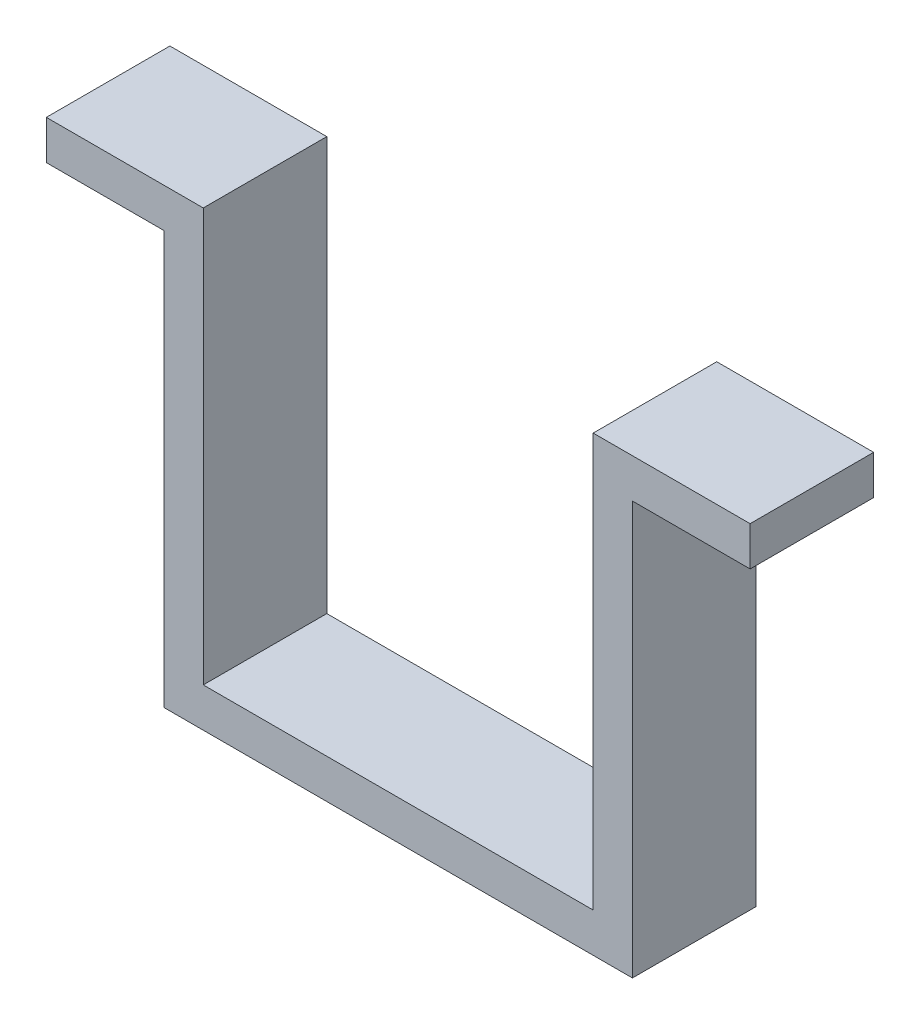
ISO-10303-21;
HEADER;
FILE_DESCRIPTION(('STEP AP214'),'2;1');
FILE_NAME('part.step','',(''),(''),'','','');
FILE_SCHEMA(('AUTOMOTIVE_DESIGN { 1 0 10303 214 1 1 1 1 }'));
ENDSEC;
DATA;
#1=APPLICATION_CONTEXT('core data for automotive mechanical design processes');
#2=APPLICATION_PROTOCOL_DEFINITION('international standard','automotive_design',2000,#1);
#3=PRODUCT_CONTEXT('',#1,'mechanical');
#4=PRODUCT('Part','Part','',(#3));
#5=PRODUCT_RELATED_PRODUCT_CATEGORY('part','',(#4));
#6=PRODUCT_DEFINITION_FORMATION('','',#4);
#7=PRODUCT_DEFINITION_CONTEXT('part definition',#1,'design');
#8=PRODUCT_DEFINITION('design','',#6,#7);
#9=PRODUCT_DEFINITION_SHAPE('','',#8);
#10=(LENGTH_UNIT() NAMED_UNIT(*) SI_UNIT(.MILLI.,.METRE.));
#11=(NAMED_UNIT(*) PLANE_ANGLE_UNIT() SI_UNIT($,.RADIAN.));
#12=(NAMED_UNIT(*) SI_UNIT($,.STERADIAN.) SOLID_ANGLE_UNIT());
#13=UNCERTAINTY_MEASURE_WITH_UNIT(LENGTH_MEASURE(1.E-05),#10,'distance_accuracy_value','');
#14=(GEOMETRIC_REPRESENTATION_CONTEXT(3) GLOBAL_UNCERTAINTY_ASSIGNED_CONTEXT((#13)) GLOBAL_UNIT_ASSIGNED_CONTEXT((#10,
#11,#12)) REPRESENTATION_CONTEXT('',''));
#15=CARTESIAN_POINT('',(0.,0.,0.));
#16=DIRECTION('',(0.,0.,1.));
#17=DIRECTION('',(1.,0.,0.));
#18=AXIS2_PLACEMENT_3D('',#15,#16,#17);
#19=CARTESIAN_POINT('',(-15.78,16.7165,10.));
#20=DIRECTION('',(0.,-1.,0.));
#21=DIRECTION('',(1.,0.,0.));
#22=AXIS2_PLACEMENT_3D('',#19,#20,#21);
#23=PLANE('',#22);
#24=DIRECTION('',(-1.,0.,0.));
#25=VECTOR('',#24,1.);
#26=CARTESIAN_POINT('',(-15.78,16.7165,0.));
#27=LINE('',#26,#25);
#28=CARTESIAN_POINT('',(-15.78,16.7165,0.));
#29=VERTEX_POINT('',#28);
#30=CARTESIAN_POINT('',(-28.48,16.7165,0.));
#31=VERTEX_POINT('',#30);
#32=EDGE_CURVE('E165',#29,#31,#27,.T.);
#33=ORIENTED_EDGE('',*,*,#32,.T.);
#34=DIRECTION('',(0.,0.,-1.));
#35=VECTOR('',#34,1.);
#36=CARTESIAN_POINT('',(-28.48,16.7165,10.));
#37=LINE('',#36,#35);
#38=CARTESIAN_POINT('',(-28.48,16.7165,10.));
#39=VERTEX_POINT('',#38);
#40=EDGE_CURVE('E11',#39,#31,#37,.T.);
#41=ORIENTED_EDGE('',*,*,#40,.F.);
#42=DIRECTION('',(-1.,0.,0.));
#43=VECTOR('',#42,1.);
#44=CARTESIAN_POINT('',(-15.78,16.7165,10.));
#45=LINE('',#44,#43);
#46=CARTESIAN_POINT('',(-15.78,16.7165,10.));
#47=VERTEX_POINT('',#46);
#48=EDGE_CURVE('E208',#47,#39,#45,.T.);
#49=ORIENTED_EDGE('',*,*,#48,.F.);
#50=DIRECTION('',(0.,0.,-1.));
#51=VECTOR('',#50,1.);
#52=CARTESIAN_POINT('',(-15.78,16.7165,10.));
#53=LINE('',#52,#51);
#54=EDGE_CURVE('E56',#47,#29,#53,.T.);
#55=ORIENTED_EDGE('',*,*,#54,.T.);
#56=EDGE_LOOP('',(#33,#41,#49,#55));
#57=FACE_BOUND('',#56,.T.);
#58=ADVANCED_FACE('F39',(#57),#23,.F.);
#59=CARTESIAN_POINT('',(-28.48,16.7165,10.));
#60=DIRECTION('',(1.,0.,0.));
#61=DIRECTION('',(0.,0.,-1.));
#62=AXIS2_PLACEMENT_3D('',#59,#60,#61);
#63=PLANE('',#62);
#64=DIRECTION('',(0.,-1.,0.));
#65=VECTOR('',#64,1.);
#66=CARTESIAN_POINT('',(-28.48,16.7165,0.));
#67=LINE('',#66,#65);
#68=CARTESIAN_POINT('',(-28.48,13.5415,0.));
#69=VERTEX_POINT('',#68);
#70=EDGE_CURVE('E168',#31,#69,#67,.T.);
#71=ORIENTED_EDGE('',*,*,#70,.T.);
#72=DIRECTION('',(0.,0.,-1.));
#73=VECTOR('',#72,1.);
#74=CARTESIAN_POINT('',(-28.48,13.5415,10.));
#75=LINE('',#74,#73);
#76=CARTESIAN_POINT('',(-28.48,13.5415,10.));
#77=VERTEX_POINT('',#76);
#78=EDGE_CURVE('E48',#77,#69,#75,.T.);
#79=ORIENTED_EDGE('',*,*,#78,.F.);
#80=DIRECTION('',(0.,-1.,0.));
#81=VECTOR('',#80,1.);
#82=CARTESIAN_POINT('',(-28.48,16.7165,10.));
#83=LINE('',#82,#81);
#84=EDGE_CURVE('E107',#39,#77,#83,.T.);
#85=ORIENTED_EDGE('',*,*,#84,.F.);
#86=ORIENTED_EDGE('',*,*,#40,.T.);
#87=EDGE_LOOP('',(#71,#79,#85,#86));
#88=FACE_BOUND('',#87,.T.);
#89=ADVANCED_FACE('F240',(#88),#63,.F.);
#90=CARTESIAN_POINT('',(-18.955,13.5415,10.));
#91=DIRECTION('',(0.,-1.,0.));
#92=DIRECTION('',(1.,0.,0.));
#93=AXIS2_PLACEMENT_3D('',#90,#91,#92);
#94=PLANE('',#93);
#95=DIRECTION('',(-1.,0.,0.));
#96=VECTOR('',#95,1.);
#97=CARTESIAN_POINT('',(-18.955,13.5415,0.));
#98=LINE('',#97,#96);
#99=CARTESIAN_POINT('',(-18.955,13.5415,0.));
#100=VERTEX_POINT('',#99);
#101=EDGE_CURVE('E172',#100,#69,#98,.T.);
#102=ORIENTED_EDGE('',*,*,#101,.F.);
#103=DIRECTION('',(0.,0.,-1.));
#104=VECTOR('',#103,1.);
#105=CARTESIAN_POINT('',(-18.955,13.5415,10.));
#106=LINE('',#105,#104);
#107=CARTESIAN_POINT('',(-18.955,13.5415,10.));
#108=VERTEX_POINT('',#107);
#109=EDGE_CURVE('E231',#108,#100,#106,.T.);
#110=ORIENTED_EDGE('',*,*,#109,.F.);
#111=DIRECTION('',(-1.,0.,0.));
#112=VECTOR('',#111,1.);
#113=CARTESIAN_POINT('',(-18.955,13.5415,10.));
#114=LINE('',#113,#112);
#115=EDGE_CURVE('E239',#108,#77,#114,.T.);
#116=ORIENTED_EDGE('',*,*,#115,.T.);
#117=ORIENTED_EDGE('',*,*,#78,.T.);
#118=EDGE_LOOP('',(#102,#110,#116,#117));
#119=FACE_BOUND('',#118,.T.);
#120=ADVANCED_FACE('F237',(#119),#94,.T.);
#121=CARTESIAN_POINT('',(-18.955,13.5415,10.));
#122=DIRECTION('',(1.,0.,0.));
#123=DIRECTION('',(0.,1.,0.));
#124=AXIS2_PLACEMENT_3D('',#121,#122,#123);
#125=PLANE('',#124);
#126=DIRECTION('',(0.,-1.,0.));
#127=VECTOR('',#126,1.);
#128=CARTESIAN_POINT('',(-18.955,13.5415,0.));
#129=LINE('',#128,#127);
#130=CARTESIAN_POINT('',(-18.955,-19.8915,0.));
#131=VERTEX_POINT('',#130);
#132=EDGE_CURVE('E176',#100,#131,#129,.T.);
#133=ORIENTED_EDGE('',*,*,#132,.T.);
#134=DIRECTION('',(0.,0.,-1.));
#135=VECTOR('',#134,1.);
#136=CARTESIAN_POINT('',(-18.955,-19.8915,10.));
#137=LINE('',#136,#135);
#138=CARTESIAN_POINT('',(-18.955,-19.8915,10.));
#139=VERTEX_POINT('',#138);
#140=EDGE_CURVE('E227',#139,#131,#137,.T.);
#141=ORIENTED_EDGE('',*,*,#140,.F.);
#142=DIRECTION('',(0.,-1.,0.));
#143=VECTOR('',#142,1.);
#144=CARTESIAN_POINT('',(-18.955,13.5415,10.));
#145=LINE('',#144,#143);
#146=EDGE_CURVE('E259',#108,#139,#145,.T.);
#147=ORIENTED_EDGE('',*,*,#146,.F.);
#148=ORIENTED_EDGE('',*,*,#109,.T.);
#149=EDGE_LOOP('',(#133,#141,#147,#148));
#150=FACE_BOUND('',#149,.T.);
#151=ADVANCED_FACE('F248',(#150),#125,.F.);
#152=CARTESIAN_POINT('',(18.955,-19.8915,10.));
#153=DIRECTION('',(0.,-1.,0.));
#154=DIRECTION('',(0.,0.,-1.));
#155=AXIS2_PLACEMENT_3D('',#152,#153,#154);
#156=PLANE('',#155);
#157=DIRECTION('',(-1.,0.,0.));
#158=VECTOR('',#157,1.);
#159=CARTESIAN_POINT('',(18.955,-19.8915,0.));
#160=LINE('',#159,#158);
#161=CARTESIAN_POINT('',(18.955,-19.8915,0.));
#162=VERTEX_POINT('',#161);
#163=EDGE_CURVE('E180',#162,#131,#160,.T.);
#164=ORIENTED_EDGE('',*,*,#163,.F.);
#165=DIRECTION('',(0.,0.,-1.));
#166=VECTOR('',#165,1.);
#167=CARTESIAN_POINT('',(18.955,-19.8915,10.));
#168=LINE('',#167,#166);
#169=CARTESIAN_POINT('',(18.955,-19.8915,10.));
#170=VERTEX_POINT('',#169);
#171=EDGE_CURVE('E224',#170,#162,#168,.T.);
#172=ORIENTED_EDGE('',*,*,#171,.F.);
#173=DIRECTION('',(1.,0.,0.));
#174=VECTOR('',#173,1.);
#175=CARTESIAN_POINT('',(-18.955,-19.8915,10.));
#176=LINE('',#175,#174);
#177=EDGE_CURVE('E254',#139,#170,#176,.T.);
#178=ORIENTED_EDGE('',*,*,#177,.F.);
#179=ORIENTED_EDGE('',*,*,#140,.T.);
#180=EDGE_LOOP('',(#164,#172,#178,#179));
#181=FACE_BOUND('',#180,.T.);
#182=ADVANCED_FACE('F252',(#181),#156,.T.);
#183=CARTESIAN_POINT('',(18.955,13.5415,10.));
#184=DIRECTION('',(1.,0.,0.));
#185=DIRECTION('',(0.,1.,0.));
#186=AXIS2_PLACEMENT_3D('',#183,#184,#185);
#187=PLANE('',#186);
#188=DIRECTION('',(0.,-1.,0.));
#189=VECTOR('',#188,1.);
#190=CARTESIAN_POINT('',(18.955,13.5415,0.));
#191=LINE('',#190,#189);
#192=CARTESIAN_POINT('',(18.955,13.5415,0.));
#193=VERTEX_POINT('',#192);
#194=EDGE_CURVE('E183',#193,#162,#191,.T.);
#195=ORIENTED_EDGE('',*,*,#194,.F.);
#196=DIRECTION('',(0.,0.,-1.));
#197=VECTOR('',#196,1.);
#198=CARTESIAN_POINT('',(18.955,13.5415,10.));
#199=LINE('',#198,#197);
#200=CARTESIAN_POINT('',(18.955,13.5415,10.));
#201=VERTEX_POINT('',#200);
#202=EDGE_CURVE('E221',#201,#193,#199,.T.);
#203=ORIENTED_EDGE('',*,*,#202,.F.);
#204=DIRECTION('',(0.,-1.,0.));
#205=VECTOR('',#204,1.);
#206=CARTESIAN_POINT('',(18.955,13.5415,10.));
#207=LINE('',#206,#205);
#208=EDGE_CURVE('E258',#201,#170,#207,.T.);
#209=ORIENTED_EDGE('',*,*,#208,.T.);
#210=ORIENTED_EDGE('',*,*,#171,.T.);
#211=EDGE_LOOP('',(#195,#203,#209,#210));
#212=FACE_BOUND('',#211,.T.);
#213=ADVANCED_FACE('F306',(#212),#187,.T.);
#214=CARTESIAN_POINT('',(18.955,13.5415,10.));
#215=DIRECTION('',(0.,1.,0.));
#216=DIRECTION('',(0.,0.,1.));
#217=AXIS2_PLACEMENT_3D('',#214,#215,#216);
#218=PLANE('',#217);
#219=DIRECTION('',(1.,0.,0.));
#220=VECTOR('',#219,1.);
#221=CARTESIAN_POINT('',(18.955,13.5415,0.));
#222=LINE('',#221,#220);
#223=CARTESIAN_POINT('',(28.48,13.5415,0.));
#224=VERTEX_POINT('',#223);
#225=EDGE_CURVE('E187',#193,#224,#222,.T.);
#226=ORIENTED_EDGE('',*,*,#225,.T.);
#227=DIRECTION('',(0.,0.,-1.));
#228=VECTOR('',#227,1.);
#229=CARTESIAN_POINT('',(28.48,13.5415,10.));
#230=LINE('',#229,#228);
#231=CARTESIAN_POINT('',(28.48,13.5415,10.));
#232=VERTEX_POINT('',#231);
#233=EDGE_CURVE('E218',#232,#224,#230,.T.);
#234=ORIENTED_EDGE('',*,*,#233,.F.);
#235=DIRECTION('',(1.,0.,0.));
#236=VECTOR('',#235,1.);
#237=CARTESIAN_POINT('',(18.955,13.5415,10.));
#238=LINE('',#237,#236);
#239=EDGE_CURVE('E263',#201,#232,#238,.T.);
#240=ORIENTED_EDGE('',*,*,#239,.F.);
#241=ORIENTED_EDGE('',*,*,#202,.T.);
#242=EDGE_LOOP('',(#226,#234,#240,#241));
#243=FACE_BOUND('',#242,.T.);
#244=ADVANCED_FACE('F309',(#243),#218,.F.);
#245=CARTESIAN_POINT('',(28.48,16.7165,10.));
#246=DIRECTION('',(1.,0.,0.));
#247=DIRECTION('',(0.,0.,-1.));
#248=AXIS2_PLACEMENT_3D('',#245,#246,#247);
#249=PLANE('',#248);
#250=DIRECTION('',(0.,-1.,0.));
#251=VECTOR('',#250,1.);
#252=CARTESIAN_POINT('',(28.48,16.7165,0.));
#253=LINE('',#252,#251);
#254=CARTESIAN_POINT('',(28.48,16.7165,0.));
#255=VERTEX_POINT('',#254);
#256=EDGE_CURVE('E191',#255,#224,#253,.T.);
#257=ORIENTED_EDGE('',*,*,#256,.F.);
#258=DIRECTION('',(0.,0.,-1.));
#259=VECTOR('',#258,1.);
#260=CARTESIAN_POINT('',(28.48,16.7165,10.));
#261=LINE('',#260,#259);
#262=CARTESIAN_POINT('',(28.48,16.7165,10.));
#263=VERTEX_POINT('',#262);
#264=EDGE_CURVE('E215',#263,#255,#261,.T.);
#265=ORIENTED_EDGE('',*,*,#264,.F.);
#266=DIRECTION('',(0.,-1.,0.));
#267=VECTOR('',#266,1.);
#268=CARTESIAN_POINT('',(28.48,16.7165,10.));
#269=LINE('',#268,#267);
#270=EDGE_CURVE('E270',#263,#232,#269,.T.);
#271=ORIENTED_EDGE('',*,*,#270,.T.);
#272=ORIENTED_EDGE('',*,*,#233,.T.);
#273=EDGE_LOOP('',(#257,#265,#271,#272));
#274=FACE_BOUND('',#273,.T.);
#275=ADVANCED_FACE('F313',(#274),#249,.T.);
#276=CARTESIAN_POINT('',(15.78,16.7165,10.));
#277=DIRECTION('',(0.,1.,0.));
#278=DIRECTION('',(-1.,0.,0.));
#279=AXIS2_PLACEMENT_3D('',#276,#277,#278);
#280=PLANE('',#279);
#281=DIRECTION('',(1.,0.,0.));
#282=VECTOR('',#281,1.);
#283=CARTESIAN_POINT('',(15.78,16.7165,0.));
#284=LINE('',#283,#282);
#285=CARTESIAN_POINT('',(15.78,16.7165,0.));
#286=VERTEX_POINT('',#285);
#287=EDGE_CURVE('E195',#286,#255,#284,.T.);
#288=ORIENTED_EDGE('',*,*,#287,.F.);
#289=DIRECTION('',(0.,0.,-1.));
#290=VECTOR('',#289,1.);
#291=CARTESIAN_POINT('',(15.78,16.7165,10.));
#292=LINE('',#291,#290);
#293=CARTESIAN_POINT('',(15.78,16.7165,10.));
#294=VERTEX_POINT('',#293);
#295=EDGE_CURVE('E155',#294,#286,#292,.T.);
#296=ORIENTED_EDGE('',*,*,#295,.F.);
#297=DIRECTION('',(1.,0.,0.));
#298=VECTOR('',#297,1.);
#299=CARTESIAN_POINT('',(15.78,16.7165,10.));
#300=LINE('',#299,#298);
#301=EDGE_CURVE('E143',#294,#263,#300,.T.);
#302=ORIENTED_EDGE('',*,*,#301,.T.);
#303=ORIENTED_EDGE('',*,*,#264,.T.);
#304=EDGE_LOOP('',(#288,#296,#302,#303));
#305=FACE_BOUND('',#304,.T.);
#306=ADVANCED_FACE('F276',(#305),#280,.T.);
#307=CARTESIAN_POINT('',(15.78,16.7165,10.));
#308=DIRECTION('',(1.,0.,0.));
#309=DIRECTION('',(0.,0.,-1.));
#310=AXIS2_PLACEMENT_3D('',#307,#308,#309);
#311=PLANE('',#310);
#312=DIRECTION('',(0.,-1.,0.));
#313=VECTOR('',#312,1.);
#314=CARTESIAN_POINT('',(15.78,16.7165,0.));
#315=LINE('',#314,#313);
#316=CARTESIAN_POINT('',(15.78,-16.7165,0.));
#317=VERTEX_POINT('',#316);
#318=EDGE_CURVE('E152',#286,#317,#315,.T.);
#319=ORIENTED_EDGE('',*,*,#318,.T.);
#320=DIRECTION('',(0.,0.,-1.));
#321=VECTOR('',#320,1.);
#322=CARTESIAN_POINT('',(15.78,-16.7165,10.));
#323=LINE('',#322,#321);
#324=CARTESIAN_POINT('',(15.78,-16.7165,10.));
#325=VERTEX_POINT('',#324);
#326=EDGE_CURVE('E149',#325,#317,#323,.T.);
#327=ORIENTED_EDGE('',*,*,#326,.F.);
#328=DIRECTION('',(0.,-1.,0.));
#329=VECTOR('',#328,1.);
#330=CARTESIAN_POINT('',(15.78,16.7165,10.));
#331=LINE('',#330,#329);
#332=EDGE_CURVE('E135',#294,#325,#331,.T.);
#333=ORIENTED_EDGE('',*,*,#332,.F.);
#334=ORIENTED_EDGE('',*,*,#295,.T.);
#335=EDGE_LOOP('',(#319,#327,#333,#334));
#336=FACE_BOUND('',#335,.T.);
#337=ADVANCED_FACE('F150',(#336),#311,.F.);
#338=CARTESIAN_POINT('',(-15.78,-16.7165,10.));
#339=DIRECTION('',(0.,1.,0.));
#340=DIRECTION('',(-1.,0.,0.));
#341=AXIS2_PLACEMENT_3D('',#338,#339,#340);
#342=PLANE('',#341);
#343=DIRECTION('',(1.,0.,0.));
#344=VECTOR('',#343,1.);
#345=CARTESIAN_POINT('',(-15.78,-16.7165,0.));
#346=LINE('',#345,#344);
#347=CARTESIAN_POINT('',(-15.78,-16.7165,0.));
#348=VERTEX_POINT('',#347);
#349=EDGE_CURVE('E201',#348,#317,#346,.T.);
#350=ORIENTED_EDGE('',*,*,#349,.F.);
#351=DIRECTION('',(0.,0.,-1.));
#352=VECTOR('',#351,1.);
#353=CARTESIAN_POINT('',(-15.78,-16.7165,10.));
#354=LINE('',#353,#352);
#355=CARTESIAN_POINT('',(-15.78,-16.7165,10.));
#356=VERTEX_POINT('',#355);
#357=EDGE_CURVE('E95',#356,#348,#354,.T.);
#358=ORIENTED_EDGE('',*,*,#357,.F.);
#359=DIRECTION('',(-1.,0.,0.));
#360=VECTOR('',#359,1.);
#361=CARTESIAN_POINT('',(15.78,-16.7165,10.));
#362=LINE('',#361,#360);
#363=EDGE_CURVE('E140',#325,#356,#362,.T.);
#364=ORIENTED_EDGE('',*,*,#363,.F.);
#365=ORIENTED_EDGE('',*,*,#326,.T.);
#366=EDGE_LOOP('',(#350,#358,#364,#365));
#367=FACE_BOUND('',#366,.T.);
#368=ADVANCED_FACE('F157',(#367),#342,.T.);
#369=CARTESIAN_POINT('',(-15.78,16.7165,10.));
#370=DIRECTION('',(1.,0.,0.));
#371=DIRECTION('',(0.,0.,-1.));
#372=AXIS2_PLACEMENT_3D('',#369,#370,#371);
#373=PLANE('',#372);
#374=DIRECTION('',(0.,-1.,0.));
#375=VECTOR('',#374,1.);
#376=CARTESIAN_POINT('',(-15.78,16.7165,0.));
#377=LINE('',#376,#375);
#378=EDGE_CURVE('E204',#29,#348,#377,.T.);
#379=ORIENTED_EDGE('',*,*,#378,.F.);
#380=ORIENTED_EDGE('',*,*,#54,.F.);
#381=DIRECTION('',(0.,-1.,0.));
#382=VECTOR('',#381,1.);
#383=CARTESIAN_POINT('',(-15.78,16.7165,10.));
#384=LINE('',#383,#382);
#385=EDGE_CURVE('E159',#47,#356,#384,.T.);
#386=ORIENTED_EDGE('',*,*,#385,.T.);
#387=ORIENTED_EDGE('',*,*,#357,.T.);
#388=EDGE_LOOP('',(#379,#380,#386,#387));
#389=FACE_BOUND('',#388,.T.);
#390=ADVANCED_FACE('F278',(#389),#373,.T.);
#391=CARTESIAN_POINT('',(0.,0.,10.));
#392=DIRECTION('',(0.,0.,1.));
#393=DIRECTION('',(1.,0.,0.));
#394=AXIS2_PLACEMENT_3D('',#391,#392,#393);
#395=PLANE('',#394);
#396=ORIENTED_EDGE('',*,*,#48,.T.);
#397=ORIENTED_EDGE('',*,*,#84,.T.);
#398=ORIENTED_EDGE('',*,*,#115,.F.);
#399=ORIENTED_EDGE('',*,*,#146,.T.);
#400=ORIENTED_EDGE('',*,*,#177,.T.);
#401=ORIENTED_EDGE('',*,*,#208,.F.);
#402=ORIENTED_EDGE('',*,*,#239,.T.);
#403=ORIENTED_EDGE('',*,*,#270,.F.);
#404=ORIENTED_EDGE('',*,*,#301,.F.);
#405=ORIENTED_EDGE('',*,*,#332,.T.);
#406=ORIENTED_EDGE('',*,*,#363,.T.);
#407=ORIENTED_EDGE('',*,*,#385,.F.);
#408=EDGE_LOOP('',(#396,#397,#398,#399,#400,#401,#402,#403,#404,#405,#406,#407));
#409=FACE_BOUND('',#408,.T.);
#410=ADVANCED_FACE('F137',(#409),#395,.T.);
#411=CARTESIAN_POINT('',(0.,0.,0.));
#412=DIRECTION('',(0.,0.,1.));
#413=DIRECTION('',(1.,0.,0.));
#414=AXIS2_PLACEMENT_3D('',#411,#412,#413);
#415=PLANE('',#414);
#416=ORIENTED_EDGE('',*,*,#32,.F.);
#417=ORIENTED_EDGE('',*,*,#378,.T.);
#418=ORIENTED_EDGE('',*,*,#349,.T.);
#419=ORIENTED_EDGE('',*,*,#318,.F.);
#420=ORIENTED_EDGE('',*,*,#287,.T.);
#421=ORIENTED_EDGE('',*,*,#256,.T.);
#422=ORIENTED_EDGE('',*,*,#225,.F.);
#423=ORIENTED_EDGE('',*,*,#194,.T.);
#424=ORIENTED_EDGE('',*,*,#163,.T.);
#425=ORIENTED_EDGE('',*,*,#132,.F.);
#426=ORIENTED_EDGE('',*,*,#101,.T.);
#427=ORIENTED_EDGE('',*,*,#70,.F.);
#428=EDGE_LOOP('',(#416,#417,#418,#419,#420,#421,#422,#423,#424,#425,#426,#427));
#429=FACE_BOUND('',#428,.T.);
#430=ADVANCED_FACE('F244',(#429),#415,.F.);
#431=CLOSED_SHELL('',(#58,#89,#120,#151,#182,#213,#244,#275,#306,#337,#368,#390,#410,#430));
#432=MANIFOLD_SOLID_BREP('B2',#431);
#433=ADVANCED_BREP_SHAPE_REPRESENTATION('',(#18,#432),#14);
#434=SHAPE_DEFINITION_REPRESENTATION(#9,#433);
ENDSEC;
END-ISO-10303-21;
